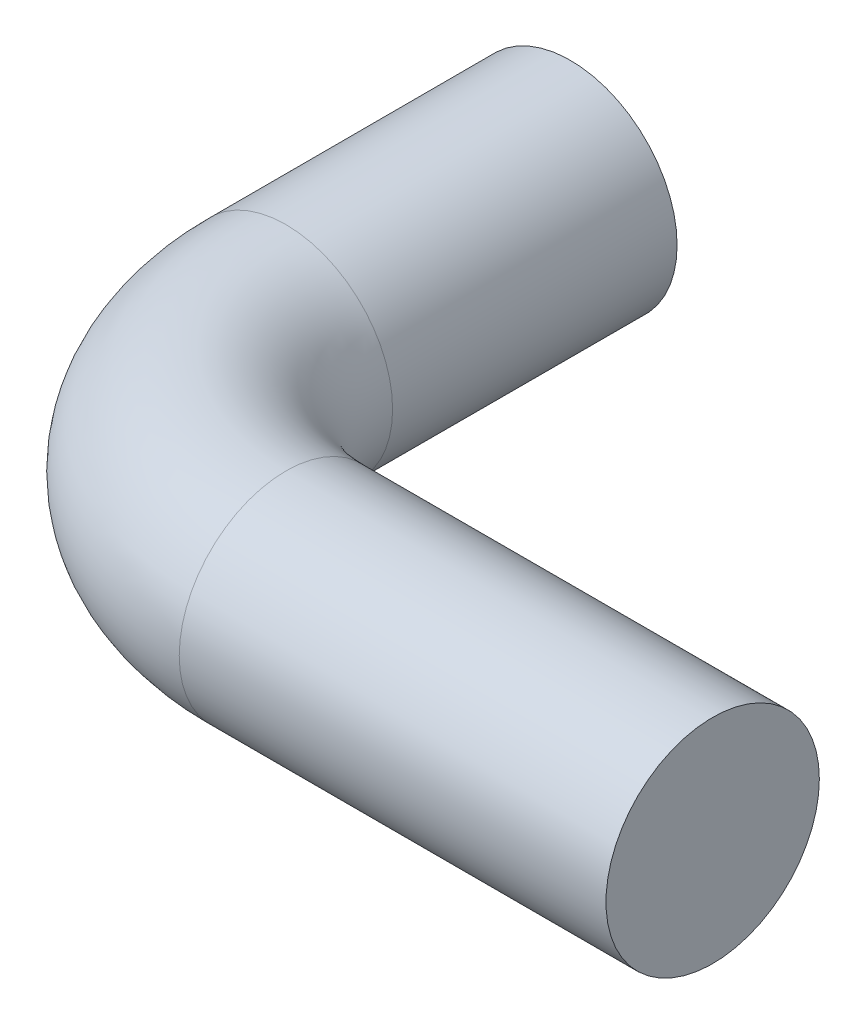
ISO-10303-21;
HEADER;
FILE_DESCRIPTION(('STEP AP214'),'2;1');
FILE_NAME('part.step','',(''),(''),'','','');
FILE_SCHEMA(('AUTOMOTIVE_DESIGN { 1 0 10303 214 1 1 1 1 }'));
ENDSEC;
DATA;
#1=APPLICATION_CONTEXT('core data for automotive mechanical design processes');
#2=APPLICATION_PROTOCOL_DEFINITION('international standard','automotive_design',2000,#1);
#3=PRODUCT_CONTEXT('',#1,'mechanical');
#4=PRODUCT('Part','Part','',(#3));
#5=PRODUCT_RELATED_PRODUCT_CATEGORY('part','',(#4));
#6=PRODUCT_DEFINITION_FORMATION('','',#4);
#7=PRODUCT_DEFINITION_CONTEXT('part definition',#1,'design');
#8=PRODUCT_DEFINITION('design','',#6,#7);
#9=PRODUCT_DEFINITION_SHAPE('','',#8);
#10=(LENGTH_UNIT() NAMED_UNIT(*) SI_UNIT(.MILLI.,.METRE.));
#11=(NAMED_UNIT(*) PLANE_ANGLE_UNIT() SI_UNIT($,.RADIAN.));
#12=(NAMED_UNIT(*) SI_UNIT($,.STERADIAN.) SOLID_ANGLE_UNIT());
#13=UNCERTAINTY_MEASURE_WITH_UNIT(LENGTH_MEASURE(1.E-05),#10,'distance_accuracy_value','');
#14=(GEOMETRIC_REPRESENTATION_CONTEXT(3) GLOBAL_UNCERTAINTY_ASSIGNED_CONTEXT((#13)) GLOBAL_UNIT_ASSIGNED_CONTEXT((#10,
#11,#12)) REPRESENTATION_CONTEXT('',''));
#15=CARTESIAN_POINT('',(0.,0.,0.));
#16=DIRECTION('',(0.,0.,1.));
#17=DIRECTION('',(1.,0.,0.));
#18=AXIS2_PLACEMENT_3D('',#15,#16,#17);
#19=CARTESIAN_POINT('',(-75.,0.,-175.));
#20=DIRECTION('',(0.,0.,1.));
#21=DIRECTION('',(1.,0.,0.));
#22=AXIS2_PLACEMENT_3D('',#19,#20,#21);
#23=PLANE('',#22);
#24=CARTESIAN_POINT('',(-75.,0.,-175.));
#25=DIRECTION('',(0.,0.,1.));
#26=DIRECTION('',(1.,0.,0.));
#27=AXIS2_PLACEMENT_3D('',#24,#25,#26);
#28=CIRCLE('',#27,37.5);
#29=CARTESIAN_POINT('',(-37.5,0.,-175.));
#30=VERTEX_POINT('',#29);
#31=EDGE_CURVE('E72',#30,#30,#28,.T.);
#32=ORIENTED_EDGE('',*,*,#31,.F.);
#33=EDGE_LOOP('',(#32));
#34=FACE_BOUND('',#33,.T.);
#35=ADVANCED_FACE('F55',(#34),#23,.F.);
#36=CARTESIAN_POINT('',(150.,0.,0.));
#37=DIRECTION('',(1.,0.,0.));
#38=DIRECTION('',(0.,0.,-1.));
#39=AXIS2_PLACEMENT_3D('',#36,#37,#38);
#40=PLANE('',#39);
#41=CARTESIAN_POINT('',(150.,0.,0.));
#42=DIRECTION('',(1.,0.,0.));
#43=DIRECTION('',(0.,0.,-1.));
#44=AXIS2_PLACEMENT_3D('',#41,#42,#43);
#45=CIRCLE('',#44,37.5);
#46=CARTESIAN_POINT('',(150.,0.,-37.5));
#47=VERTEX_POINT('',#46);
#48=EDGE_CURVE('E11',#47,#47,#45,.T.);
#49=ORIENTED_EDGE('',*,*,#48,.T.);
#50=EDGE_LOOP('',(#49));
#51=FACE_BOUND('',#50,.T.);
#52=ADVANCED_FACE('F82',(#51),#40,.T.);
#53=CARTESIAN_POINT('',(-75.,0.,-175.));
#54=DIRECTION('',(0.,0.,1.));
#55=DIRECTION('',(1.,0.,0.));
#56=AXIS2_PLACEMENT_3D('',#53,#54,#55);
#57=CYLINDRICAL_SURFACE('',#56,37.5);
#58=CARTESIAN_POINT('',(-75.,0.,-75.));
#59=DIRECTION('',(0.,0.,1.));
#60=DIRECTION('',(1.,0.,0.));
#61=AXIS2_PLACEMENT_3D('',#58,#59,#60);
#62=CIRCLE('',#61,37.5);
#63=CARTESIAN_POINT('',(-112.5,0.,-75.0000000000001));
#64=VERTEX_POINT('',#63);
#65=EDGE_CURVE('E67',#64,#64,#62,.T.);
#66=ORIENTED_EDGE('',*,*,#65,.F.);
#67=EDGE_LOOP('',(#66));
#68=FACE_BOUND('',#67,.T.);
#69=ORIENTED_EDGE('',*,*,#31,.T.);
#70=EDGE_LOOP('',(#69));
#71=FACE_BOUND('',#70,.T.);
#72=ADVANCED_FACE('F79',(#68,#71),#57,.T.);
#73=CARTESIAN_POINT('',(0.,0.,-75.));
#74=DIRECTION('',(0.,1.,0.));
#75=DIRECTION('',(0.,0.,1.));
#76=AXIS2_PLACEMENT_3D('',#73,#74,#75);
#77=TOROIDAL_SURFACE('',#76,75.0000000000001,37.5);
#78=CARTESIAN_POINT('',(0.,0.,0.));
#79=DIRECTION('',(1.,0.,0.));
#80=DIRECTION('',(0.,0.,-1.));
#81=AXIS2_PLACEMENT_3D('',#78,#79,#80);
#82=CIRCLE('',#81,37.5);
#83=CARTESIAN_POINT('',(0.,0.,37.5));
#84=VERTEX_POINT('',#83);
#85=EDGE_CURVE('E62',#84,#84,#82,.T.);
#86=CARTESIAN_POINT('',(0.,0.,-75.));
#87=DIRECTION('',(0.,1.,0.));
#88=DIRECTION('',(0.,0.,1.));
#89=AXIS2_PLACEMENT_3D('',#86,#87,#88);
#90=CIRCLE('',#89,112.5);
#91=EDGE_CURVE('',#64,#84,#90,.T.);
#92=ORIENTED_EDGE('',*,*,#65,.T.);
#93=ORIENTED_EDGE('',*,*,#85,.F.);
#94=ORIENTED_EDGE('',*,*,#91,.T.);
#95=ORIENTED_EDGE('',*,*,#91,.F.);
#96=EDGE_LOOP('',(#92,#94,#93,#95));
#97=FACE_BOUND('',#96,.T.);
#98=ADVANCED_FACE('F88',(#97),#77,.T.);
#99=CARTESIAN_POINT('',(0.,0.,0.));
#100=DIRECTION('',(1.,0.,0.));
#101=DIRECTION('',(0.,0.,-1.));
#102=AXIS2_PLACEMENT_3D('',#99,#100,#101);
#103=CYLINDRICAL_SURFACE('',#102,37.5);
#104=ORIENTED_EDGE('',*,*,#48,.F.);
#105=EDGE_LOOP('',(#104));
#106=FACE_BOUND('',#105,.T.);
#107=ORIENTED_EDGE('',*,*,#85,.T.);
#108=EDGE_LOOP('',(#107));
#109=FACE_BOUND('',#108,.T.);
#110=ADVANCED_FACE('F86',(#106,#109),#103,.T.);
#111=CLOSED_SHELL('',(#35,#52,#72,#98,#110));
#112=MANIFOLD_SOLID_BREP('B2',#111);
#113=ADVANCED_BREP_SHAPE_REPRESENTATION('',(#18,#112),#14);
#114=SHAPE_DEFINITION_REPRESENTATION(#9,#113);
ENDSEC;
END-ISO-10303-21;
